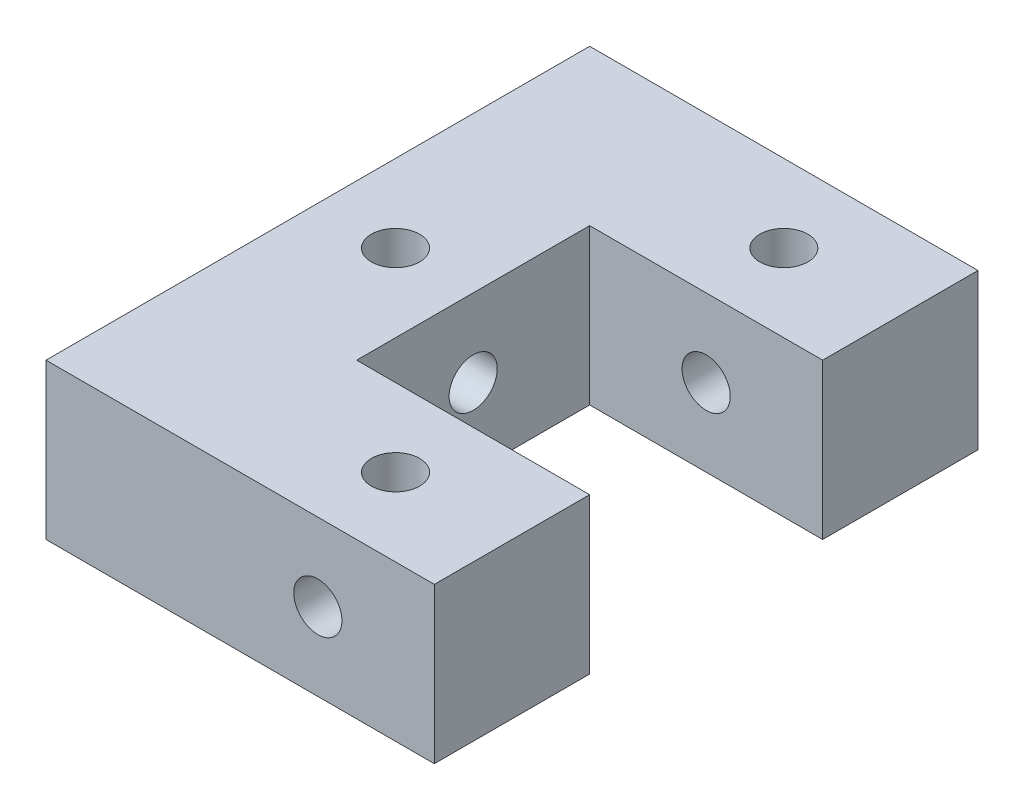
ISO-10303-21;
HEADER;
FILE_DESCRIPTION(('STEP AP214'),'2;1');
FILE_NAME('part.step','',(''),(''),'','','');
FILE_SCHEMA(('AUTOMOTIVE_DESIGN { 1 0 10303 214 1 1 1 1 }'));
ENDSEC;
DATA;
#1=APPLICATION_CONTEXT('core data for automotive mechanical design processes');
#2=APPLICATION_PROTOCOL_DEFINITION('international standard','automotive_design',2000,#1);
#3=PRODUCT_CONTEXT('',#1,'mechanical');
#4=PRODUCT('Part','Part','',(#3));
#5=PRODUCT_RELATED_PRODUCT_CATEGORY('part','',(#4));
#6=PRODUCT_DEFINITION_FORMATION('','',#4);
#7=PRODUCT_DEFINITION_CONTEXT('part definition',#1,'design');
#8=PRODUCT_DEFINITION('design','',#6,#7);
#9=PRODUCT_DEFINITION_SHAPE('','',#8);
#10=(LENGTH_UNIT() NAMED_UNIT(*) SI_UNIT(.MILLI.,.METRE.));
#11=(NAMED_UNIT(*) PLANE_ANGLE_UNIT() SI_UNIT($,.RADIAN.));
#12=(NAMED_UNIT(*) SI_UNIT($,.STERADIAN.) SOLID_ANGLE_UNIT());
#13=UNCERTAINTY_MEASURE_WITH_UNIT(LENGTH_MEASURE(1.E-05),#10,'distance_accuracy_value','');
#14=(GEOMETRIC_REPRESENTATION_CONTEXT(3) GLOBAL_UNCERTAINTY_ASSIGNED_CONTEXT((#13)) GLOBAL_UNIT_ASSIGNED_CONTEXT((#10,
#11,#12)) REPRESENTATION_CONTEXT('',''));
#15=CARTESIAN_POINT('',(0.,0.,0.));
#16=DIRECTION('',(0.,0.,1.));
#17=DIRECTION('',(1.,0.,0.));
#18=AXIS2_PLACEMENT_3D('',#15,#16,#17);
#19=CARTESIAN_POINT('',(17.5,10.,5.));
#20=DIRECTION('',(0.,-1.,0.));
#21=DIRECTION('',(0.,0.,-1.));
#22=AXIS2_PLACEMENT_3D('',#19,#20,#21);
#23=CYLINDRICAL_SURFACE('',#22,1.55);
#24=CARTESIAN_POINT('',(17.5,5.,5.));
#25=DIRECTION('',(0.,-0.707106781186547,0.707106781186547));
#26=DIRECTION('',(0.,-0.707106781186547,-0.707106781186547));
#27=AXIS2_PLACEMENT_3D('',#24,#25,#26);
#28=ELLIPSE('',#27,2.1920310216783,1.55);
#29=CARTESIAN_POINT('',(15.95,5.,5.));
#30=VERTEX_POINT('',#29);
#31=CARTESIAN_POINT('',(19.05,5.,5.));
#32=VERTEX_POINT('',#31);
#33=EDGE_CURVE('E288',#30,#32,#28,.F.);
#34=ORIENTED_EDGE('',*,*,#33,.F.);
#35=CARTESIAN_POINT('',(17.5,5.,5.));
#36=DIRECTION('',(0.,-0.707106781186547,-0.707106781186547));
#37=DIRECTION('',(0.,-0.707106781186547,0.707106781186547));
#38=AXIS2_PLACEMENT_3D('',#35,#36,#37);
#39=ELLIPSE('',#38,2.1920310216783,1.55);
#40=EDGE_CURVE('E62',#32,#30,#39,.F.);
#41=ORIENTED_EDGE('',*,*,#40,.F.);
#42=EDGE_LOOP('',(#34,#41));
#43=FACE_BOUND('',#42,.T.);
#44=CARTESIAN_POINT('',(17.5,10.,5.));
#45=DIRECTION('',(0.,1.,0.));
#46=DIRECTION('',(0.,0.,1.));
#47=AXIS2_PLACEMENT_3D('',#44,#45,#46);
#48=CIRCLE('',#47,1.55);
#49=CARTESIAN_POINT('',(17.5,10.,6.55));
#50=VERTEX_POINT('',#49);
#51=EDGE_CURVE('E253',#50,#50,#48,.T.);
#52=ORIENTED_EDGE('',*,*,#51,.T.);
#53=EDGE_LOOP('',(#52));
#54=FACE_BOUND('',#53,.T.);
#55=ADVANCED_FACE('F47',(#43,#54),#23,.F.);
#56=CARTESIAN_POINT('',(17.5,10.,30.));
#57=DIRECTION('',(0.,-1.,0.));
#58=DIRECTION('',(0.,0.,-1.));
#59=AXIS2_PLACEMENT_3D('',#56,#57,#58);
#60=CYLINDRICAL_SURFACE('',#59,1.55);
#61=CARTESIAN_POINT('',(17.5,5.,30.));
#62=DIRECTION('',(0.,-0.707106781186547,0.707106781186547));
#63=DIRECTION('',(0.,-0.707106781186547,-0.707106781186547));
#64=AXIS2_PLACEMENT_3D('',#61,#62,#63);
#65=ELLIPSE('',#64,2.1920310216783,1.55);
#66=CARTESIAN_POINT('',(15.95,5.,30.));
#67=VERTEX_POINT('',#66);
#68=CARTESIAN_POINT('',(19.05,5.,30.));
#69=VERTEX_POINT('',#68);
#70=EDGE_CURVE('E11',#67,#69,#65,.F.);
#71=ORIENTED_EDGE('',*,*,#70,.F.);
#72=CARTESIAN_POINT('',(17.5,5.,30.));
#73=DIRECTION('',(0.,-0.707106781186547,-0.707106781186547));
#74=DIRECTION('',(0.,-0.707106781186547,0.707106781186547));
#75=AXIS2_PLACEMENT_3D('',#72,#73,#74);
#76=ELLIPSE('',#75,2.1920310216783,1.55);
#77=EDGE_CURVE('E69',#69,#67,#76,.F.);
#78=ORIENTED_EDGE('',*,*,#77,.F.);
#79=EDGE_LOOP('',(#71,#78));
#80=FACE_BOUND('',#79,.T.);
#81=CARTESIAN_POINT('',(17.5,10.,30.));
#82=DIRECTION('',(0.,1.,0.));
#83=DIRECTION('',(0.,0.,1.));
#84=AXIS2_PLACEMENT_3D('',#81,#82,#83);
#85=CIRCLE('',#84,1.55);
#86=CARTESIAN_POINT('',(17.5,10.,31.55));
#87=VERTEX_POINT('',#86);
#88=EDGE_CURVE('E261',#87,#87,#85,.T.);
#89=ORIENTED_EDGE('',*,*,#88,.T.);
#90=EDGE_LOOP('',(#89));
#91=FACE_BOUND('',#90,.T.);
#92=ADVANCED_FACE('F145',(#80,#91),#60,.F.);
#93=CARTESIAN_POINT('',(5.,10.,17.5));
#94=DIRECTION('',(0.,-1.,0.));
#95=DIRECTION('',(0.,0.,-1.));
#96=AXIS2_PLACEMENT_3D('',#93,#94,#95);
#97=CYLINDRICAL_SURFACE('',#96,1.55);
#98=CARTESIAN_POINT('',(5.,5.,17.5));
#99=DIRECTION('',(-0.707106781186547,-0.707106781186547,0.));
#100=DIRECTION('',(0.707106781186547,-0.707106781186547,0.));
#101=AXIS2_PLACEMENT_3D('',#98,#99,#100);
#102=ELLIPSE('',#101,2.1920310216783,1.55);
#103=CARTESIAN_POINT('',(5.,5.,15.95));
#104=VERTEX_POINT('',#103);
#105=CARTESIAN_POINT('',(5.,5.,19.05));
#106=VERTEX_POINT('',#105);
#107=EDGE_CURVE('E143',#104,#106,#102,.F.);
#108=ORIENTED_EDGE('',*,*,#107,.F.);
#109=CARTESIAN_POINT('',(5.,5.,17.5));
#110=DIRECTION('',(0.707106781186547,-0.707106781186547,0.));
#111=DIRECTION('',(-0.707106781186547,-0.707106781186547,0.));
#112=AXIS2_PLACEMENT_3D('',#109,#110,#111);
#113=ELLIPSE('',#112,2.1920310216783,1.55);
#114=EDGE_CURVE('E164',#106,#104,#113,.F.);
#115=ORIENTED_EDGE('',*,*,#114,.F.);
#116=EDGE_LOOP('',(#108,#115));
#117=FACE_BOUND('',#116,.T.);
#118=CARTESIAN_POINT('',(5.,10.,17.5));
#119=DIRECTION('',(0.,1.,0.));
#120=DIRECTION('',(0.,0.,1.));
#121=AXIS2_PLACEMENT_3D('',#118,#119,#120);
#122=CIRCLE('',#121,1.55);
#123=CARTESIAN_POINT('',(5.,10.,19.05));
#124=VERTEX_POINT('',#123);
#125=EDGE_CURVE('E225',#124,#124,#122,.T.);
#126=ORIENTED_EDGE('',*,*,#125,.T.);
#127=EDGE_LOOP('',(#126));
#128=FACE_BOUND('',#127,.T.);
#129=ADVANCED_FACE('F370',(#117,#128),#97,.F.);
#130=CARTESIAN_POINT('',(0.,10.,0.));
#131=DIRECTION('',(0.,-1.,0.));
#132=DIRECTION('',(0.,0.,-1.));
#133=AXIS2_PLACEMENT_3D('',#130,#131,#132);
#134=PLANE('',#133);
#135=DIRECTION('',(0.,0.,1.));
#136=VECTOR('',#135,1.);
#137=CARTESIAN_POINT('',(0.,10.,35.));
#138=LINE('',#137,#136);
#139=CARTESIAN_POINT('',(0.,10.,0.));
#140=VERTEX_POINT('',#139);
#141=CARTESIAN_POINT('',(0.,10.,35.));
#142=VERTEX_POINT('',#141);
#143=EDGE_CURVE('E203',#140,#142,#138,.T.);
#144=ORIENTED_EDGE('',*,*,#143,.T.);
#145=DIRECTION('',(1.,0.,0.));
#146=VECTOR('',#145,1.);
#147=CARTESIAN_POINT('',(25.,10.,35.));
#148=LINE('',#147,#146);
#149=CARTESIAN_POINT('',(25.,10.,35.));
#150=VERTEX_POINT('',#149);
#151=EDGE_CURVE('E243',#142,#150,#148,.T.);
#152=ORIENTED_EDGE('',*,*,#151,.T.);
#153=DIRECTION('',(0.,0.,-1.));
#154=VECTOR('',#153,1.);
#155=CARTESIAN_POINT('',(25.,10.,25.));
#156=LINE('',#155,#154);
#157=CARTESIAN_POINT('',(25.,10.,25.));
#158=VERTEX_POINT('',#157);
#159=EDGE_CURVE('E240',#150,#158,#156,.T.);
#160=ORIENTED_EDGE('',*,*,#159,.T.);
#161=DIRECTION('',(-1.,0.,0.));
#162=VECTOR('',#161,1.);
#163=CARTESIAN_POINT('',(10.,10.,25.));
#164=LINE('',#163,#162);
#165=CARTESIAN_POINT('',(10.,10.,25.));
#166=VERTEX_POINT('',#165);
#167=EDGE_CURVE('E237',#158,#166,#164,.T.);
#168=ORIENTED_EDGE('',*,*,#167,.T.);
#169=DIRECTION('',(0.,0.,-1.));
#170=VECTOR('',#169,1.);
#171=CARTESIAN_POINT('',(10.,10.,10.));
#172=LINE('',#171,#170);
#173=CARTESIAN_POINT('',(10.,10.,10.));
#174=VERTEX_POINT('',#173);
#175=EDGE_CURVE('E234',#166,#174,#172,.T.);
#176=ORIENTED_EDGE('',*,*,#175,.T.);
#177=DIRECTION('',(1.,0.,0.));
#178=VECTOR('',#177,1.);
#179=CARTESIAN_POINT('',(25.,10.,10.));
#180=LINE('',#179,#178);
#181=CARTESIAN_POINT('',(25.,10.,10.));
#182=VERTEX_POINT('',#181);
#183=EDGE_CURVE('E231',#174,#182,#180,.T.);
#184=ORIENTED_EDGE('',*,*,#183,.T.);
#185=DIRECTION('',(0.,0.,-1.));
#186=VECTOR('',#185,1.);
#187=CARTESIAN_POINT('',(25.,10.,0.));
#188=LINE('',#187,#186);
#189=CARTESIAN_POINT('',(25.,10.,0.));
#190=VERTEX_POINT('',#189);
#191=EDGE_CURVE('E228',#182,#190,#188,.T.);
#192=ORIENTED_EDGE('',*,*,#191,.T.);
#193=DIRECTION('',(-1.,0.,0.));
#194=VECTOR('',#193,1.);
#195=CARTESIAN_POINT('',(0.,10.,0.));
#196=LINE('',#195,#194);
#197=EDGE_CURVE('E199',#190,#140,#196,.T.);
#198=ORIENTED_EDGE('',*,*,#197,.T.);
#199=EDGE_LOOP('',(#144,#152,#160,#168,#176,#184,#192,#198));
#200=FACE_BOUND('',#199,.T.);
#201=ORIENTED_EDGE('',*,*,#125,.F.);
#202=EDGE_LOOP('',(#201));
#203=FACE_BOUND('',#202,.T.);
#204=ORIENTED_EDGE('',*,*,#51,.F.);
#205=EDGE_LOOP('',(#204));
#206=FACE_BOUND('',#205,.T.);
#207=ORIENTED_EDGE('',*,*,#88,.F.);
#208=EDGE_LOOP('',(#207));
#209=FACE_BOUND('',#208,.T.);
#210=ADVANCED_FACE('F337',(#200,#203,#206,#209),#134,.F.);
#211=CARTESIAN_POINT('',(0.,0.,0.));
#212=DIRECTION('',(0.,-1.,0.));
#213=DIRECTION('',(0.,0.,-1.));
#214=AXIS2_PLACEMENT_3D('',#211,#212,#213);
#215=PLANE('',#214);
#216=CARTESIAN_POINT('',(17.5,0.,5.));
#217=DIRECTION('',(0.,1.,0.));
#218=DIRECTION('',(0.,0.,1.));
#219=AXIS2_PLACEMENT_3D('',#216,#217,#218);
#220=CIRCLE('',#219,1.55);
#221=CARTESIAN_POINT('',(17.5,0.,6.55));
#222=VERTEX_POINT('',#221);
#223=EDGE_CURVE('E257',#222,#222,#220,.T.);
#224=ORIENTED_EDGE('',*,*,#223,.T.);
#225=EDGE_LOOP('',(#224));
#226=FACE_BOUND('',#225,.T.);
#227=DIRECTION('',(0.,0.,1.));
#228=VECTOR('',#227,1.);
#229=CARTESIAN_POINT('',(0.,0.,35.));
#230=LINE('',#229,#228);
#231=CARTESIAN_POINT('',(0.,0.,0.));
#232=VERTEX_POINT('',#231);
#233=CARTESIAN_POINT('',(0.,0.,35.));
#234=VERTEX_POINT('',#233);
#235=EDGE_CURVE('E221',#232,#234,#230,.T.);
#236=ORIENTED_EDGE('',*,*,#235,.F.);
#237=DIRECTION('',(-1.,0.,0.));
#238=VECTOR('',#237,1.);
#239=CARTESIAN_POINT('',(0.,0.,0.));
#240=LINE('',#239,#238);
#241=CARTESIAN_POINT('',(25.,0.,0.));
#242=VERTEX_POINT('',#241);
#243=EDGE_CURVE('E200',#242,#232,#240,.T.);
#244=ORIENTED_EDGE('',*,*,#243,.F.);
#245=DIRECTION('',(0.,0.,-1.));
#246=VECTOR('',#245,1.);
#247=CARTESIAN_POINT('',(25.,0.,0.));
#248=LINE('',#247,#246);
#249=CARTESIAN_POINT('',(25.,0.,10.));
#250=VERTEX_POINT('',#249);
#251=EDGE_CURVE('E204',#250,#242,#248,.T.);
#252=ORIENTED_EDGE('',*,*,#251,.F.);
#253=DIRECTION('',(1.,0.,0.));
#254=VECTOR('',#253,1.);
#255=CARTESIAN_POINT('',(25.,0.,10.));
#256=LINE('',#255,#254);
#257=CARTESIAN_POINT('',(10.,0.,10.));
#258=VERTEX_POINT('',#257);
#259=EDGE_CURVE('E206',#258,#250,#256,.T.);
#260=ORIENTED_EDGE('',*,*,#259,.F.);
#261=DIRECTION('',(0.,0.,-1.));
#262=VECTOR('',#261,1.);
#263=CARTESIAN_POINT('',(10.,0.,10.));
#264=LINE('',#263,#262);
#265=CARTESIAN_POINT('',(10.,0.,25.));
#266=VERTEX_POINT('',#265);
#267=EDGE_CURVE('E209',#266,#258,#264,.T.);
#268=ORIENTED_EDGE('',*,*,#267,.F.);
#269=DIRECTION('',(-1.,0.,0.));
#270=VECTOR('',#269,1.);
#271=CARTESIAN_POINT('',(10.,0.,25.));
#272=LINE('',#271,#270);
#273=CARTESIAN_POINT('',(25.,0.,25.));
#274=VERTEX_POINT('',#273);
#275=EDGE_CURVE('E212',#274,#266,#272,.T.);
#276=ORIENTED_EDGE('',*,*,#275,.F.);
#277=DIRECTION('',(0.,0.,-1.));
#278=VECTOR('',#277,1.);
#279=CARTESIAN_POINT('',(25.,0.,25.));
#280=LINE('',#279,#278);
#281=CARTESIAN_POINT('',(25.,0.,35.));
#282=VERTEX_POINT('',#281);
#283=EDGE_CURVE('E215',#282,#274,#280,.T.);
#284=ORIENTED_EDGE('',*,*,#283,.F.);
#285=DIRECTION('',(1.,0.,0.));
#286=VECTOR('',#285,1.);
#287=CARTESIAN_POINT('',(25.,0.,35.));
#288=LINE('',#287,#286);
#289=EDGE_CURVE('E218',#234,#282,#288,.T.);
#290=ORIENTED_EDGE('',*,*,#289,.F.);
#291=EDGE_LOOP('',(#236,#244,#252,#260,#268,#276,#284,#290));
#292=FACE_BOUND('',#291,.T.);
#293=CARTESIAN_POINT('',(5.,0.,17.5));
#294=DIRECTION('',(0.,1.,0.));
#295=DIRECTION('',(0.,0.,1.));
#296=AXIS2_PLACEMENT_3D('',#293,#294,#295);
#297=CIRCLE('',#296,1.55);
#298=CARTESIAN_POINT('',(5.,0.,19.05));
#299=VERTEX_POINT('',#298);
#300=EDGE_CURVE('E249',#299,#299,#297,.T.);
#301=ORIENTED_EDGE('',*,*,#300,.T.);
#302=EDGE_LOOP('',(#301));
#303=FACE_BOUND('',#302,.T.);
#304=CARTESIAN_POINT('',(17.5,0.,30.));
#305=DIRECTION('',(0.,1.,0.));
#306=DIRECTION('',(0.,0.,1.));
#307=AXIS2_PLACEMENT_3D('',#304,#305,#306);
#308=CIRCLE('',#307,1.55);
#309=CARTESIAN_POINT('',(17.5,0.,31.55));
#310=VERTEX_POINT('',#309);
#311=EDGE_CURVE('E265',#310,#310,#308,.T.);
#312=ORIENTED_EDGE('',*,*,#311,.T.);
#313=EDGE_LOOP('',(#312));
#314=FACE_BOUND('',#313,.T.);
#315=ADVANCED_FACE('F323',(#226,#292,#303,#314),#215,.T.);
#316=CARTESIAN_POINT('',(0.,10.,35.));
#317=DIRECTION('',(1.,0.,0.));
#318=DIRECTION('',(0.,0.,-1.));
#319=AXIS2_PLACEMENT_3D('',#316,#317,#318);
#320=PLANE('',#319);
#321=CARTESIAN_POINT('',(0.,5.,17.5));
#322=DIRECTION('',(-1.,0.,0.));
#323=DIRECTION('',(0.,0.,1.));
#324=AXIS2_PLACEMENT_3D('',#321,#322,#323);
#325=CIRCLE('',#324,1.55);
#326=CARTESIAN_POINT('',(0.,5.,19.05));
#327=VERTEX_POINT('',#326);
#328=EDGE_CURVE('E276',#327,#327,#325,.T.);
#329=ORIENTED_EDGE('',*,*,#328,.F.);
#330=EDGE_LOOP('',(#329));
#331=FACE_BOUND('',#330,.T.);
#332=ORIENTED_EDGE('',*,*,#235,.T.);
#333=DIRECTION('',(0.,-1.,0.));
#334=VECTOR('',#333,1.);
#335=CARTESIAN_POINT('',(0.,10.,35.));
#336=LINE('',#335,#334);
#337=EDGE_CURVE('E168',#142,#234,#336,.T.);
#338=ORIENTED_EDGE('',*,*,#337,.F.);
#339=ORIENTED_EDGE('',*,*,#143,.F.);
#340=DIRECTION('',(0.,-1.,0.));
#341=VECTOR('',#340,1.);
#342=CARTESIAN_POINT('',(0.,10.,0.));
#343=LINE('',#342,#341);
#344=EDGE_CURVE('E195',#140,#232,#343,.T.);
#345=ORIENTED_EDGE('',*,*,#344,.T.);
#346=EDGE_LOOP('',(#332,#338,#339,#345));
#347=FACE_BOUND('',#346,.T.);
#348=ADVANCED_FACE('F49',(#331,#347),#320,.F.);
#349=CARTESIAN_POINT('',(25.,10.,35.));
#350=DIRECTION('',(0.,0.,-1.));
#351=DIRECTION('',(-1.,0.,0.));
#352=AXIS2_PLACEMENT_3D('',#349,#350,#351);
#353=PLANE('',#352);
#354=CARTESIAN_POINT('',(17.5,5.,35.));
#355=DIRECTION('',(0.,0.,1.));
#356=DIRECTION('',(1.,0.,0.));
#357=AXIS2_PLACEMENT_3D('',#354,#355,#356);
#358=CIRCLE('',#357,1.55);
#359=CARTESIAN_POINT('',(19.05,5.,35.));
#360=VERTEX_POINT('',#359);
#361=EDGE_CURVE('E304',#360,#360,#358,.T.);
#362=ORIENTED_EDGE('',*,*,#361,.F.);
#363=EDGE_LOOP('',(#362));
#364=FACE_BOUND('',#363,.T.);
#365=ORIENTED_EDGE('',*,*,#289,.T.);
#366=DIRECTION('',(0.,-1.,0.));
#367=VECTOR('',#366,1.);
#368=CARTESIAN_POINT('',(25.,10.,35.));
#369=LINE('',#368,#367);
#370=EDGE_CURVE('E172',#150,#282,#369,.T.);
#371=ORIENTED_EDGE('',*,*,#370,.F.);
#372=ORIENTED_EDGE('',*,*,#151,.F.);
#373=ORIENTED_EDGE('',*,*,#337,.T.);
#374=EDGE_LOOP('',(#365,#371,#372,#373));
#375=FACE_BOUND('',#374,.T.);
#376=ADVANCED_FACE('F310',(#364,#375),#353,.F.);
#377=CARTESIAN_POINT('',(25.,10.,25.));
#378=DIRECTION('',(-1.,0.,0.));
#379=DIRECTION('',(0.,0.,1.));
#380=AXIS2_PLACEMENT_3D('',#377,#378,#379);
#381=PLANE('',#380);
#382=ORIENTED_EDGE('',*,*,#283,.T.);
#383=DIRECTION('',(0.,-1.,0.));
#384=VECTOR('',#383,1.);
#385=CARTESIAN_POINT('',(25.,10.,25.));
#386=LINE('',#385,#384);
#387=EDGE_CURVE('E176',#158,#274,#386,.T.);
#388=ORIENTED_EDGE('',*,*,#387,.F.);
#389=ORIENTED_EDGE('',*,*,#159,.F.);
#390=ORIENTED_EDGE('',*,*,#370,.T.);
#391=EDGE_LOOP('',(#382,#388,#389,#390));
#392=FACE_BOUND('',#391,.T.);
#393=ADVANCED_FACE('F313',(#392),#381,.F.);
#394=CARTESIAN_POINT('',(10.,10.,25.));
#395=DIRECTION('',(0.,0.,1.));
#396=DIRECTION('',(1.,0.,0.));
#397=AXIS2_PLACEMENT_3D('',#394,#395,#396);
#398=PLANE('',#397);
#399=CARTESIAN_POINT('',(17.5,5.,25.));
#400=DIRECTION('',(0.,0.,1.));
#401=DIRECTION('',(1.,0.,0.));
#402=AXIS2_PLACEMENT_3D('',#399,#400,#401);
#403=CIRCLE('',#402,1.55);
#404=CARTESIAN_POINT('',(19.05,5.,25.));
#405=VERTEX_POINT('',#404);
#406=EDGE_CURVE('E280',#405,#405,#403,.T.);
#407=ORIENTED_EDGE('',*,*,#406,.T.);
#408=EDGE_LOOP('',(#407));
#409=FACE_BOUND('',#408,.T.);
#410=ORIENTED_EDGE('',*,*,#275,.T.);
#411=DIRECTION('',(0.,-1.,0.));
#412=VECTOR('',#411,1.);
#413=CARTESIAN_POINT('',(10.,10.,25.));
#414=LINE('',#413,#412);
#415=EDGE_CURVE('E180',#166,#266,#414,.T.);
#416=ORIENTED_EDGE('',*,*,#415,.F.);
#417=ORIENTED_EDGE('',*,*,#167,.F.);
#418=ORIENTED_EDGE('',*,*,#387,.T.);
#419=EDGE_LOOP('',(#410,#416,#417,#418));
#420=FACE_BOUND('',#419,.T.);
#421=ADVANCED_FACE('F329',(#409,#420),#398,.F.);
#422=CARTESIAN_POINT('',(10.,10.,10.));
#423=DIRECTION('',(-1.,0.,0.));
#424=DIRECTION('',(0.,0.,1.));
#425=AXIS2_PLACEMENT_3D('',#422,#423,#424);
#426=PLANE('',#425);
#427=CARTESIAN_POINT('',(10.,5.,17.5));
#428=DIRECTION('',(-1.,0.,0.));
#429=DIRECTION('',(0.,0.,1.));
#430=AXIS2_PLACEMENT_3D('',#427,#428,#429);
#431=CIRCLE('',#430,1.55);
#432=CARTESIAN_POINT('',(10.,5.,19.05));
#433=VERTEX_POINT('',#432);
#434=EDGE_CURVE('E269',#433,#433,#431,.F.);
#435=ORIENTED_EDGE('',*,*,#434,.F.);
#436=EDGE_LOOP('',(#435));
#437=FACE_BOUND('',#436,.T.);
#438=ORIENTED_EDGE('',*,*,#267,.T.);
#439=DIRECTION('',(0.,-1.,0.));
#440=VECTOR('',#439,1.);
#441=CARTESIAN_POINT('',(10.,10.,10.));
#442=LINE('',#441,#440);
#443=EDGE_CURVE('E184',#174,#258,#442,.T.);
#444=ORIENTED_EDGE('',*,*,#443,.F.);
#445=ORIENTED_EDGE('',*,*,#175,.F.);
#446=ORIENTED_EDGE('',*,*,#415,.T.);
#447=EDGE_LOOP('',(#438,#444,#445,#446));
#448=FACE_BOUND('',#447,.T.);
#449=ADVANCED_FACE('F333',(#437,#448),#426,.F.);
#450=CARTESIAN_POINT('',(25.,10.,10.));
#451=DIRECTION('',(0.,0.,-1.));
#452=DIRECTION('',(-1.,0.,0.));
#453=AXIS2_PLACEMENT_3D('',#450,#451,#452);
#454=PLANE('',#453);
#455=CARTESIAN_POINT('',(17.5,5.,10.));
#456=DIRECTION('',(0.,0.,-1.));
#457=DIRECTION('',(-1.,0.,0.));
#458=AXIS2_PLACEMENT_3D('',#455,#456,#457);
#459=CIRCLE('',#458,1.55);
#460=CARTESIAN_POINT('',(15.95,5.,10.));
#461=VERTEX_POINT('',#460);
#462=EDGE_CURVE('E284',#461,#461,#459,.T.);
#463=ORIENTED_EDGE('',*,*,#462,.T.);
#464=EDGE_LOOP('',(#463));
#465=FACE_BOUND('',#464,.T.);
#466=ORIENTED_EDGE('',*,*,#259,.T.);
#467=DIRECTION('',(0.,-1.,0.));
#468=VECTOR('',#467,1.);
#469=CARTESIAN_POINT('',(25.,10.,10.));
#470=LINE('',#469,#468);
#471=EDGE_CURVE('E187',#182,#250,#470,.T.);
#472=ORIENTED_EDGE('',*,*,#471,.F.);
#473=ORIENTED_EDGE('',*,*,#183,.F.);
#474=ORIENTED_EDGE('',*,*,#443,.T.);
#475=EDGE_LOOP('',(#466,#472,#473,#474));
#476=FACE_BOUND('',#475,.T.);
#477=ADVANCED_FACE('F353',(#465,#476),#454,.F.);
#478=CARTESIAN_POINT('',(25.,10.,0.));
#479=DIRECTION('',(-1.,0.,0.));
#480=DIRECTION('',(0.,0.,1.));
#481=AXIS2_PLACEMENT_3D('',#478,#479,#480);
#482=PLANE('',#481);
#483=ORIENTED_EDGE('',*,*,#251,.T.);
#484=DIRECTION('',(0.,-1.,0.));
#485=VECTOR('',#484,1.);
#486=CARTESIAN_POINT('',(25.,10.,0.));
#487=LINE('',#486,#485);
#488=EDGE_CURVE('E191',#190,#242,#487,.T.);
#489=ORIENTED_EDGE('',*,*,#488,.F.);
#490=ORIENTED_EDGE('',*,*,#191,.F.);
#491=ORIENTED_EDGE('',*,*,#471,.T.);
#492=EDGE_LOOP('',(#483,#489,#490,#491));
#493=FACE_BOUND('',#492,.T.);
#494=ADVANCED_FACE('F351',(#493),#482,.F.);
#495=CARTESIAN_POINT('',(0.,10.,0.));
#496=DIRECTION('',(0.,0.,1.));
#497=DIRECTION('',(1.,0.,0.));
#498=AXIS2_PLACEMENT_3D('',#495,#496,#497);
#499=PLANE('',#498);
#500=CARTESIAN_POINT('',(17.5,5.,0.));
#501=DIRECTION('',(0.,0.,1.));
#502=DIRECTION('',(1.,0.,0.));
#503=AXIS2_PLACEMENT_3D('',#500,#501,#502);
#504=CIRCLE('',#503,1.55);
#505=CARTESIAN_POINT('',(19.05,5.,0.));
#506=VERTEX_POINT('',#505);
#507=EDGE_CURVE('E300',#506,#506,#504,.F.);
#508=ORIENTED_EDGE('',*,*,#507,.F.);
#509=EDGE_LOOP('',(#508));
#510=FACE_BOUND('',#509,.T.);
#511=ORIENTED_EDGE('',*,*,#243,.T.);
#512=ORIENTED_EDGE('',*,*,#344,.F.);
#513=ORIENTED_EDGE('',*,*,#197,.F.);
#514=ORIENTED_EDGE('',*,*,#488,.T.);
#515=EDGE_LOOP('',(#511,#512,#513,#514));
#516=FACE_BOUND('',#515,.T.);
#517=ADVANCED_FACE('F347',(#510,#516),#499,.F.);
#518=CARTESIAN_POINT('',(5.,5.,17.5));
#519=DIRECTION('',(-0.707106781186547,-0.707106781186547,0.));
#520=DIRECTION('',(0.707106781186547,-0.707106781186547,0.));
#521=AXIS2_PLACEMENT_3D('',#518,#519,#520);
#522=ELLIPSE('',#521,2.1920310216783,1.55);
#523=EDGE_CURVE('E157',#104,#106,#522,.T.);
#524=ORIENTED_EDGE('',*,*,#523,.F.);
#525=CARTESIAN_POINT('',(5.,5.,17.5));
#526=DIRECTION('',(0.707106781186547,-0.707106781186547,0.));
#527=DIRECTION('',(-0.707106781186547,-0.707106781186547,0.));
#528=AXIS2_PLACEMENT_3D('',#525,#526,#527);
#529=ELLIPSE('',#528,2.1920310216783,1.55);
#530=EDGE_CURVE('E161',#106,#104,#529,.T.);
#531=ORIENTED_EDGE('',*,*,#530,.F.);
#532=EDGE_LOOP('',(#524,#531));
#533=FACE_BOUND('',#532,.T.);
#534=ORIENTED_EDGE('',*,*,#300,.F.);
#535=EDGE_LOOP('',(#534));
#536=FACE_BOUND('',#535,.T.);
#537=ADVANCED_FACE('F375',(#533,#536),#97,.F.);
#538=CARTESIAN_POINT('',(17.5,5.,5.));
#539=DIRECTION('',(0.,-0.707106781186547,0.707106781186547));
#540=DIRECTION('',(0.,-0.707106781186547,-0.707106781186547));
#541=AXIS2_PLACEMENT_3D('',#538,#539,#540);
#542=ELLIPSE('',#541,2.1920310216783,1.55);
#543=EDGE_CURVE('E292',#30,#32,#542,.T.);
#544=ORIENTED_EDGE('',*,*,#543,.F.);
#545=CARTESIAN_POINT('',(17.5,5.,5.));
#546=DIRECTION('',(0.,-0.707106781186547,-0.707106781186547));
#547=DIRECTION('',(0.,-0.707106781186547,0.707106781186547));
#548=AXIS2_PLACEMENT_3D('',#545,#546,#547);
#549=ELLIPSE('',#548,2.1920310216783,1.55);
#550=EDGE_CURVE('E295',#32,#30,#549,.T.);
#551=ORIENTED_EDGE('',*,*,#550,.F.);
#552=EDGE_LOOP('',(#544,#551));
#553=FACE_BOUND('',#552,.T.);
#554=ORIENTED_EDGE('',*,*,#223,.F.);
#555=EDGE_LOOP('',(#554));
#556=FACE_BOUND('',#555,.T.);
#557=ADVANCED_FACE('F366',(#553,#556),#23,.F.);
#558=CARTESIAN_POINT('',(17.5,5.,30.));
#559=DIRECTION('',(0.,-0.707106781186547,0.707106781186547));
#560=DIRECTION('',(0.,-0.707106781186547,-0.707106781186547));
#561=AXIS2_PLACEMENT_3D('',#558,#559,#560);
#562=ELLIPSE('',#561,2.1920310216783,1.55);
#563=EDGE_CURVE('E56',#67,#69,#562,.T.);
#564=ORIENTED_EDGE('',*,*,#563,.F.);
#565=CARTESIAN_POINT('',(17.5,5.,30.));
#566=DIRECTION('',(0.,-0.707106781186547,-0.707106781186547));
#567=DIRECTION('',(0.,-0.707106781186547,0.707106781186547));
#568=AXIS2_PLACEMENT_3D('',#565,#566,#567);
#569=ELLIPSE('',#568,2.1920310216783,1.55);
#570=EDGE_CURVE('E132',#69,#67,#569,.T.);
#571=ORIENTED_EDGE('',*,*,#570,.F.);
#572=EDGE_LOOP('',(#564,#571));
#573=FACE_BOUND('',#572,.T.);
#574=ORIENTED_EDGE('',*,*,#311,.F.);
#575=EDGE_LOOP('',(#574));
#576=FACE_BOUND('',#575,.T.);
#577=ADVANCED_FACE('F147',(#573,#576),#60,.F.);
#578=CARTESIAN_POINT('',(14.3840620433566,5.,17.5));
#579=DIRECTION('',(-1.,0.,0.));
#580=DIRECTION('',(0.,0.,1.));
#581=AXIS2_PLACEMENT_3D('',#578,#579,#580);
#582=CYLINDRICAL_SURFACE('',#581,1.55);
#583=ORIENTED_EDGE('',*,*,#523,.T.);
#584=ORIENTED_EDGE('',*,*,#114,.T.);
#585=EDGE_LOOP('',(#583,#584));
#586=FACE_BOUND('',#585,.T.);
#587=ORIENTED_EDGE('',*,*,#434,.T.);
#588=EDGE_LOOP('',(#587));
#589=FACE_BOUND('',#588,.T.);
#590=ADVANCED_FACE('F381',(#586,#589),#582,.F.);
#591=ORIENTED_EDGE('',*,*,#107,.T.);
#592=ORIENTED_EDGE('',*,*,#530,.T.);
#593=EDGE_LOOP('',(#591,#592));
#594=FACE_BOUND('',#593,.T.);
#595=ORIENTED_EDGE('',*,*,#328,.T.);
#596=EDGE_LOOP('',(#595));
#597=FACE_BOUND('',#596,.T.);
#598=ADVANCED_FACE('F414',(#594,#597),#582,.F.);
#599=CARTESIAN_POINT('',(17.5,5.,-4.3840620433566));
#600=DIRECTION('',(0.,0.,1.));
#601=DIRECTION('',(1.,0.,0.));
#602=AXIS2_PLACEMENT_3D('',#599,#600,#601);
#603=CYLINDRICAL_SURFACE('',#602,1.55);
#604=ORIENTED_EDGE('',*,*,#563,.T.);
#605=ORIENTED_EDGE('',*,*,#77,.T.);
#606=EDGE_LOOP('',(#604,#605));
#607=FACE_BOUND('',#606,.T.);
#608=ORIENTED_EDGE('',*,*,#406,.F.);
#609=EDGE_LOOP('',(#608));
#610=FACE_BOUND('',#609,.T.);
#611=ADVANCED_FACE('F140',(#607,#610),#603,.F.);
#612=ORIENTED_EDGE('',*,*,#70,.T.);
#613=ORIENTED_EDGE('',*,*,#570,.T.);
#614=EDGE_LOOP('',(#612,#613));
#615=FACE_BOUND('',#614,.T.);
#616=ORIENTED_EDGE('',*,*,#361,.T.);
#617=EDGE_LOOP('',(#616));
#618=FACE_BOUND('',#617,.T.);
#619=ADVANCED_FACE('F133',(#615,#618),#603,.F.);
#620=ORIENTED_EDGE('',*,*,#543,.T.);
#621=ORIENTED_EDGE('',*,*,#40,.T.);
#622=EDGE_LOOP('',(#620,#621));
#623=FACE_BOUND('',#622,.T.);
#624=ORIENTED_EDGE('',*,*,#507,.T.);
#625=EDGE_LOOP('',(#624));
#626=FACE_BOUND('',#625,.T.);
#627=ADVANCED_FACE('F403',(#623,#626),#603,.F.);
#628=ORIENTED_EDGE('',*,*,#33,.T.);
#629=ORIENTED_EDGE('',*,*,#550,.T.);
#630=EDGE_LOOP('',(#628,#629));
#631=FACE_BOUND('',#630,.T.);
#632=ORIENTED_EDGE('',*,*,#462,.F.);
#633=EDGE_LOOP('',(#632));
#634=FACE_BOUND('',#633,.T.);
#635=ADVANCED_FACE('F405',(#631,#634),#603,.F.);
#636=CLOSED_SHELL('',(#55,#92,#129,#210,#315,#348,#376,#393,#421,#449,#477,#494,#517,#537,#557,
#577,#590,#598,#611,#619,#627,#635));
#637=MANIFOLD_SOLID_BREP('B2',#636);
#638=ADVANCED_BREP_SHAPE_REPRESENTATION('',(#18,#637),#14);
#639=SHAPE_DEFINITION_REPRESENTATION(#9,#638);
ENDSEC;
END-ISO-10303-21;
